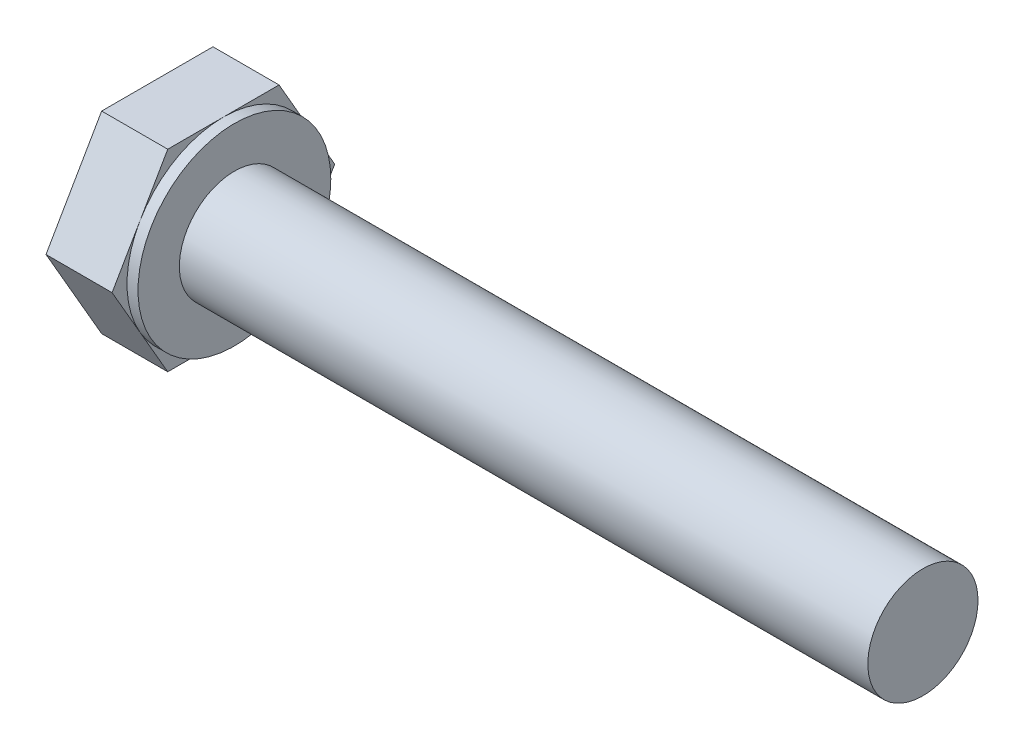
ISO-10303-21;
HEADER;
FILE_DESCRIPTION(('STEP AP214'),'2;1');
FILE_NAME('part.step','',(''),(''),'','','');
FILE_SCHEMA(('AUTOMOTIVE_DESIGN { 1 0 10303 214 1 1 1 1 }'));
ENDSEC;
DATA;
#1=APPLICATION_CONTEXT('core data for automotive mechanical design processes');
#2=APPLICATION_PROTOCOL_DEFINITION('international standard','automotive_design',2000,#1);
#3=PRODUCT_CONTEXT('',#1,'mechanical');
#4=PRODUCT('Part','Part','',(#3));
#5=PRODUCT_RELATED_PRODUCT_CATEGORY('part','',(#4));
#6=PRODUCT_DEFINITION_FORMATION('','',#4);
#7=PRODUCT_DEFINITION_CONTEXT('part definition',#1,'design');
#8=PRODUCT_DEFINITION('design','',#6,#7);
#9=PRODUCT_DEFINITION_SHAPE('','',#8);
#10=(LENGTH_UNIT() NAMED_UNIT(*) SI_UNIT(.MILLI.,.METRE.));
#11=(NAMED_UNIT(*) PLANE_ANGLE_UNIT() SI_UNIT($,.RADIAN.));
#12=(NAMED_UNIT(*) SI_UNIT($,.STERADIAN.) SOLID_ANGLE_UNIT());
#13=UNCERTAINTY_MEASURE_WITH_UNIT(LENGTH_MEASURE(1.E-05),#10,'distance_accuracy_value','');
#14=(GEOMETRIC_REPRESENTATION_CONTEXT(3) GLOBAL_UNCERTAINTY_ASSIGNED_CONTEXT((#13)) GLOBAL_UNIT_ASSIGNED_CONTEXT((#10,
#11,#12)) REPRESENTATION_CONTEXT('',''));
#15=CARTESIAN_POINT('',(0.,0.,0.));
#16=DIRECTION('',(0.,0.,1.));
#17=DIRECTION('',(1.,0.,0.));
#18=AXIS2_PLACEMENT_3D('',#15,#16,#17);
#19=CARTESIAN_POINT('',(0.4,0.,0.));
#20=DIRECTION('',(1.,0.,0.));
#21=DIRECTION('',(0.,0.,-1.));
#22=AXIS2_PLACEMENT_3D('',#19,#20,#21);
#23=PLANE('',#22);
#24=CARTESIAN_POINT('',(0.4,0.,0.));
#25=DIRECTION('',(1.,0.,0.));
#26=DIRECTION('',(0.,0.,-1.));
#27=AXIS2_PLACEMENT_3D('',#24,#25,#26);
#28=CIRCLE('',#27,3.5);
#29=CARTESIAN_POINT('',(0.4,0.,-3.5));
#30=VERTEX_POINT('',#29);
#31=EDGE_CURVE('E126',#30,#30,#28,.T.);
#32=ORIENTED_EDGE('',*,*,#31,.T.);
#33=EDGE_LOOP('',(#32));
#34=FACE_BOUND('',#33,.T.);
#35=CARTESIAN_POINT('',(0.4,0.,0.));
#36=DIRECTION('',(1.,0.,0.));
#37=DIRECTION('',(0.,0.,-1.));
#38=AXIS2_PLACEMENT_3D('',#35,#36,#37);
#39=CIRCLE('',#38,2.);
#40=CARTESIAN_POINT('',(0.4,0.,-2.));
#41=VERTEX_POINT('',#40);
#42=EDGE_CURVE('E349',#41,#41,#39,.T.);
#43=ORIENTED_EDGE('',*,*,#42,.F.);
#44=EDGE_LOOP('',(#43));
#45=FACE_BOUND('',#44,.T.);
#46=ADVANCED_FACE('F33',(#34,#45),#23,.T.);
#47=CARTESIAN_POINT('',(0.,0.,0.));
#48=DIRECTION('',(1.,0.,0.));
#49=DIRECTION('',(0.,0.,-1.));
#50=AXIS2_PLACEMENT_3D('',#47,#48,#49);
#51=PLANE('',#50);
#52=CARTESIAN_POINT('',(0.,0.,0.));
#53=DIRECTION('',(1.,0.,0.));
#54=DIRECTION('',(0.,0.,-1.));
#55=AXIS2_PLACEMENT_3D('',#52,#53,#54);
#56=CIRCLE('',#55,3.5);
#57=CARTESIAN_POINT('',(0.,1.75,-3.03108891324554));
#58=VERTEX_POINT('',#57);
#59=CARTESIAN_POINT('',(0.,3.5,0.));
#60=VERTEX_POINT('',#59);
#61=EDGE_CURVE('E44',#58,#60,#56,.T.);
#62=ORIENTED_EDGE('',*,*,#61,.F.);
#63=DIRECTION('',(0.,0.866025403784439,0.5));
#64=VECTOR('',#63,1.);
#65=CARTESIAN_POINT('',(0.,0.,-4.04145188432738));
#66=LINE('',#65,#64);
#67=CARTESIAN_POINT('',(0.,3.5,-2.02072594216369));
#68=VERTEX_POINT('',#67);
#69=EDGE_CURVE('E111',#58,#68,#66,.T.);
#70=ORIENTED_EDGE('',*,*,#69,.T.);
#71=DIRECTION('',(0.,0.,1.));
#72=VECTOR('',#71,1.);
#73=CARTESIAN_POINT('',(0.,3.5,-2.02072594216369));
#74=LINE('',#73,#72);
#75=EDGE_CURVE('E124',#68,#60,#74,.T.);
#76=ORIENTED_EDGE('',*,*,#75,.T.);
#77=EDGE_LOOP('',(#62,#70,#76));
#78=FACE_BOUND('',#77,.T.);
#79=ADVANCED_FACE('F123',(#78),#51,.T.);
#80=CARTESIAN_POINT('',(0.,1.75,3.03108891324554));
#81=VERTEX_POINT('',#80);
#82=EDGE_CURVE('E11',#60,#81,#56,.T.);
#83=ORIENTED_EDGE('',*,*,#82,.F.);
#84=CARTESIAN_POINT('',(0.,3.5,2.02072594216369));
#85=VERTEX_POINT('',#84);
#86=EDGE_CURVE('E110',#60,#85,#74,.T.);
#87=ORIENTED_EDGE('',*,*,#86,.T.);
#88=DIRECTION('',(0.,-0.866025403784439,0.5));
#89=VECTOR('',#88,1.);
#90=CARTESIAN_POINT('',(0.,3.5,2.02072594216369));
#91=LINE('',#90,#89);
#92=EDGE_CURVE('E156',#85,#81,#91,.T.);
#93=ORIENTED_EDGE('',*,*,#92,.T.);
#94=EDGE_LOOP('',(#83,#87,#93));
#95=FACE_BOUND('',#94,.T.);
#96=ADVANCED_FACE('F209',(#95),#51,.T.);
#97=CARTESIAN_POINT('',(0.,-1.75,3.03108891324554));
#98=VERTEX_POINT('',#97);
#99=EDGE_CURVE('E42',#81,#98,#56,.T.);
#100=ORIENTED_EDGE('',*,*,#99,.F.);
#101=CARTESIAN_POINT('',(0.,0.,4.04145188432738));
#102=VERTEX_POINT('',#101);
#103=EDGE_CURVE('E159',#81,#102,#91,.T.);
#104=ORIENTED_EDGE('',*,*,#103,.T.);
#105=DIRECTION('',(0.,-0.866025403784439,-0.5));
#106=VECTOR('',#105,1.);
#107=CARTESIAN_POINT('',(0.,0.,4.04145188432738));
#108=LINE('',#107,#106);
#109=EDGE_CURVE('E160',#102,#98,#108,.T.);
#110=ORIENTED_EDGE('',*,*,#109,.T.);
#111=EDGE_LOOP('',(#100,#104,#110));
#112=FACE_BOUND('',#111,.T.);
#113=ADVANCED_FACE('F190',(#112),#51,.T.);
#114=CARTESIAN_POINT('',(0.,-3.5,0.));
#115=VERTEX_POINT('',#114);
#116=EDGE_CURVE('E133',#98,#115,#56,.T.);
#117=ORIENTED_EDGE('',*,*,#116,.F.);
#118=CARTESIAN_POINT('',(0.,-3.5,2.02072594216369));
#119=VERTEX_POINT('',#118);
#120=EDGE_CURVE('E158',#98,#119,#108,.T.);
#121=ORIENTED_EDGE('',*,*,#120,.T.);
#122=DIRECTION('',(0.,0.,-1.));
#123=VECTOR('',#122,1.);
#124=CARTESIAN_POINT('',(0.,-3.5,2.02072594216369));
#125=LINE('',#124,#123);
#126=EDGE_CURVE('E164',#119,#115,#125,.T.);
#127=ORIENTED_EDGE('',*,*,#126,.T.);
#128=EDGE_LOOP('',(#117,#121,#127));
#129=FACE_BOUND('',#128,.T.);
#130=ADVANCED_FACE('F192',(#129),#51,.T.);
#131=CARTESIAN_POINT('',(0.,-1.75,-3.03108891324553));
#132=VERTEX_POINT('',#131);
#133=EDGE_CURVE('E131',#115,#132,#56,.T.);
#134=ORIENTED_EDGE('',*,*,#133,.F.);
#135=CARTESIAN_POINT('',(0.,-3.5,-2.02072594216369));
#136=VERTEX_POINT('',#135);
#137=EDGE_CURVE('E163',#115,#136,#125,.T.);
#138=ORIENTED_EDGE('',*,*,#137,.T.);
#139=DIRECTION('',(0.,0.866025403784439,-0.5));
#140=VECTOR('',#139,1.);
#141=CARTESIAN_POINT('',(0.,-3.5,-2.02072594216369));
#142=LINE('',#141,#140);
#143=EDGE_CURVE('E121',#136,#132,#142,.T.);
#144=ORIENTED_EDGE('',*,*,#143,.T.);
#145=EDGE_LOOP('',(#134,#138,#144));
#146=FACE_BOUND('',#145,.T.);
#147=ADVANCED_FACE('F199',(#146),#51,.T.);
#148=CARTESIAN_POINT('',(-2.4,3.5,2.02072594216369));
#149=DIRECTION('',(0.,0.5,0.866025403784439));
#150=DIRECTION('',(0.,-0.866025403784439,0.5));
#151=AXIS2_PLACEMENT_3D('',#148,#149,#150);
#152=PLANE('',#151);
#153=ORIENTED_EDGE('',*,*,#92,.F.);
#154=DIRECTION('',(1.,0.,0.));
#155=VECTOR('',#154,1.);
#156=CARTESIAN_POINT('',(-2.4,3.5,2.02072594216369));
#157=LINE('',#156,#155);
#158=CARTESIAN_POINT('',(-2.4,3.5,2.02072594216369));
#159=VERTEX_POINT('',#158);
#160=EDGE_CURVE('E132',#159,#85,#157,.T.);
#161=ORIENTED_EDGE('',*,*,#160,.F.);
#162=DIRECTION('',(0.,-0.866025403784439,0.5));
#163=VECTOR('',#162,1.);
#164=CARTESIAN_POINT('',(-2.4,3.5,2.02072594216369));
#165=LINE('',#164,#163);
#166=CARTESIAN_POINT('',(-2.4,0.,4.04145188432738));
#167=VERTEX_POINT('',#166);
#168=EDGE_CURVE('E139',#159,#167,#165,.T.);
#169=ORIENTED_EDGE('',*,*,#168,.T.);
#170=DIRECTION('',(1.,0.,0.));
#171=VECTOR('',#170,1.);
#172=CARTESIAN_POINT('',(-2.4,0.,4.04145188432738));
#173=LINE('',#172,#171);
#174=EDGE_CURVE('E37',#167,#102,#173,.T.);
#175=ORIENTED_EDGE('',*,*,#174,.T.);
#176=ORIENTED_EDGE('',*,*,#103,.F.);
#177=EDGE_LOOP('',(#153,#161,#169,#175,#176));
#178=FACE_BOUND('',#177,.T.);
#179=ADVANCED_FACE('F35',(#178),#152,.T.);
#180=CARTESIAN_POINT('',(-2.4,3.5,-2.02072594216369));
#181=DIRECTION('',(0.,1.,0.));
#182=DIRECTION('',(0.,0.,1.));
#183=AXIS2_PLACEMENT_3D('',#180,#181,#182);
#184=PLANE('',#183);
#185=ORIENTED_EDGE('',*,*,#75,.F.);
#186=DIRECTION('',(1.,0.,0.));
#187=VECTOR('',#186,1.);
#188=CARTESIAN_POINT('',(-2.4,3.5,-2.02072594216369));
#189=LINE('',#188,#187);
#190=CARTESIAN_POINT('',(-2.4,3.5,-2.02072594216369));
#191=VERTEX_POINT('',#190);
#192=EDGE_CURVE('E117',#191,#68,#189,.T.);
#193=ORIENTED_EDGE('',*,*,#192,.F.);
#194=DIRECTION('',(0.,0.,1.));
#195=VECTOR('',#194,1.);
#196=CARTESIAN_POINT('',(-2.4,3.5,-2.02072594216369));
#197=LINE('',#196,#195);
#198=EDGE_CURVE('E153',#191,#159,#197,.T.);
#199=ORIENTED_EDGE('',*,*,#198,.T.);
#200=ORIENTED_EDGE('',*,*,#160,.T.);
#201=ORIENTED_EDGE('',*,*,#86,.F.);
#202=EDGE_LOOP('',(#185,#193,#199,#200,#201));
#203=FACE_BOUND('',#202,.T.);
#204=ADVANCED_FACE('F208',(#203),#184,.T.);
#205=CARTESIAN_POINT('',(-2.4,0.,-4.04145188432738));
#206=DIRECTION('',(0.,0.5,-0.866025403784439));
#207=DIRECTION('',(0.,0.866025403784439,0.5));
#208=AXIS2_PLACEMENT_3D('',#205,#206,#207);
#209=PLANE('',#208);
#210=CARTESIAN_POINT('',(0.,0.,-4.04145188432738));
#211=VERTEX_POINT('',#210);
#212=EDGE_CURVE('E104',#211,#58,#66,.T.);
#213=ORIENTED_EDGE('',*,*,#212,.F.);
#214=DIRECTION('',(1.,0.,0.));
#215=VECTOR('',#214,1.);
#216=CARTESIAN_POINT('',(-2.4,0.,-4.04145188432738));
#217=LINE('',#216,#215);
#218=CARTESIAN_POINT('',(-2.4,0.,-4.04145188432738));
#219=VERTEX_POINT('',#218);
#220=EDGE_CURVE('E171',#219,#211,#217,.T.);
#221=ORIENTED_EDGE('',*,*,#220,.F.);
#222=DIRECTION('',(0.,0.866025403784439,0.5));
#223=VECTOR('',#222,1.);
#224=CARTESIAN_POINT('',(-2.4,0.,-4.04145188432738));
#225=LINE('',#224,#223);
#226=EDGE_CURVE('E151',#219,#191,#225,.T.);
#227=ORIENTED_EDGE('',*,*,#226,.T.);
#228=ORIENTED_EDGE('',*,*,#192,.T.);
#229=ORIENTED_EDGE('',*,*,#69,.F.);
#230=EDGE_LOOP('',(#213,#221,#227,#228,#229));
#231=FACE_BOUND('',#230,.T.);
#232=ADVANCED_FACE('F115',(#231),#209,.T.);
#233=CARTESIAN_POINT('',(-2.4,-3.5,-2.02072594216369));
#234=DIRECTION('',(0.,-0.5,-0.866025403784439));
#235=DIRECTION('',(0.,0.866025403784439,-0.5));
#236=AXIS2_PLACEMENT_3D('',#233,#234,#235);
#237=PLANE('',#236);
#238=ORIENTED_EDGE('',*,*,#143,.F.);
#239=DIRECTION('',(1.,0.,0.));
#240=VECTOR('',#239,1.);
#241=CARTESIAN_POINT('',(-2.4,-3.5,-2.02072594216369));
#242=LINE('',#241,#240);
#243=CARTESIAN_POINT('',(-2.4,-3.5,-2.02072594216369));
#244=VERTEX_POINT('',#243);
#245=EDGE_CURVE('E173',#244,#136,#242,.T.);
#246=ORIENTED_EDGE('',*,*,#245,.F.);
#247=DIRECTION('',(0.,0.866025403784439,-0.5));
#248=VECTOR('',#247,1.);
#249=CARTESIAN_POINT('',(-2.4,-3.5,-2.02072594216369));
#250=LINE('',#249,#248);
#251=EDGE_CURVE('E148',#244,#219,#250,.T.);
#252=ORIENTED_EDGE('',*,*,#251,.T.);
#253=ORIENTED_EDGE('',*,*,#220,.T.);
#254=EDGE_CURVE('E107',#132,#211,#142,.T.);
#255=ORIENTED_EDGE('',*,*,#254,.F.);
#256=EDGE_LOOP('',(#238,#246,#252,#253,#255));
#257=FACE_BOUND('',#256,.T.);
#258=ADVANCED_FACE('F201',(#257),#237,.T.);
#259=CARTESIAN_POINT('',(-2.4,-3.5,2.02072594216369));
#260=DIRECTION('',(0.,-1.,0.));
#261=DIRECTION('',(0.,0.,-1.));
#262=AXIS2_PLACEMENT_3D('',#259,#260,#261);
#263=PLANE('',#262);
#264=ORIENTED_EDGE('',*,*,#126,.F.);
#265=DIRECTION('',(1.,0.,0.));
#266=VECTOR('',#265,1.);
#267=CARTESIAN_POINT('',(-2.4,-3.5,2.02072594216369));
#268=LINE('',#267,#266);
#269=CARTESIAN_POINT('',(-2.4,-3.5,2.02072594216369));
#270=VERTEX_POINT('',#269);
#271=EDGE_CURVE('E175',#270,#119,#268,.T.);
#272=ORIENTED_EDGE('',*,*,#271,.F.);
#273=DIRECTION('',(0.,0.,-1.));
#274=VECTOR('',#273,1.);
#275=CARTESIAN_POINT('',(-2.4,-3.5,2.02072594216369));
#276=LINE('',#275,#274);
#277=EDGE_CURVE('E145',#270,#244,#276,.T.);
#278=ORIENTED_EDGE('',*,*,#277,.T.);
#279=ORIENTED_EDGE('',*,*,#245,.T.);
#280=ORIENTED_EDGE('',*,*,#137,.F.);
#281=EDGE_LOOP('',(#264,#272,#278,#279,#280));
#282=FACE_BOUND('',#281,.T.);
#283=ADVANCED_FACE('F195',(#282),#263,.T.);
#284=CARTESIAN_POINT('',(-2.4,0.,4.04145188432738));
#285=DIRECTION('',(0.,-0.5,0.866025403784439));
#286=DIRECTION('',(0.,-0.866025403784439,-0.5));
#287=AXIS2_PLACEMENT_3D('',#284,#285,#286);
#288=PLANE('',#287);
#289=ORIENTED_EDGE('',*,*,#109,.F.);
#290=ORIENTED_EDGE('',*,*,#174,.F.);
#291=DIRECTION('',(0.,-0.866025403784439,-0.5));
#292=VECTOR('',#291,1.);
#293=CARTESIAN_POINT('',(-2.4,0.,4.04145188432738));
#294=LINE('',#293,#292);
#295=EDGE_CURVE('E142',#167,#270,#294,.T.);
#296=ORIENTED_EDGE('',*,*,#295,.T.);
#297=ORIENTED_EDGE('',*,*,#271,.T.);
#298=ORIENTED_EDGE('',*,*,#120,.F.);
#299=EDGE_LOOP('',(#289,#290,#296,#297,#298));
#300=FACE_BOUND('',#299,.T.);
#301=ADVANCED_FACE('F187',(#300),#288,.T.);
#302=CARTESIAN_POINT('',(-2.4,0.,0.));
#303=DIRECTION('',(1.,0.,0.));
#304=DIRECTION('',(0.,0.,-1.));
#305=AXIS2_PLACEMENT_3D('',#302,#303,#304);
#306=PLANE('',#305);
#307=ORIENTED_EDGE('',*,*,#168,.F.);
#308=ORIENTED_EDGE('',*,*,#198,.F.);
#309=ORIENTED_EDGE('',*,*,#226,.F.);
#310=ORIENTED_EDGE('',*,*,#251,.F.);
#311=ORIENTED_EDGE('',*,*,#277,.F.);
#312=ORIENTED_EDGE('',*,*,#295,.F.);
#313=EDGE_LOOP('',(#307,#308,#309,#310,#311,#312));
#314=FACE_BOUND('',#313,.T.);
#315=ADVANCED_FACE('F206',(#314),#306,.F.);
#316=EDGE_CURVE('E57',#132,#58,#56,.T.);
#317=ORIENTED_EDGE('',*,*,#316,.F.);
#318=ORIENTED_EDGE('',*,*,#254,.T.);
#319=ORIENTED_EDGE('',*,*,#212,.T.);
#320=EDGE_LOOP('',(#317,#318,#319));
#321=FACE_BOUND('',#320,.T.);
#322=ADVANCED_FACE('F106',(#321),#51,.T.);
#323=CARTESIAN_POINT('',(0.4,0.,0.));
#324=DIRECTION('',(-1.,0.,0.));
#325=DIRECTION('',(0.,0.,1.));
#326=AXIS2_PLACEMENT_3D('',#323,#324,#325);
#327=CYLINDRICAL_SURFACE('',#326,3.5);
#328=ORIENTED_EDGE('',*,*,#31,.F.);
#329=EDGE_LOOP('',(#328));
#330=FACE_BOUND('',#329,.T.);
#331=ORIENTED_EDGE('',*,*,#61,.T.);
#332=ORIENTED_EDGE('',*,*,#82,.T.);
#333=ORIENTED_EDGE('',*,*,#99,.T.);
#334=ORIENTED_EDGE('',*,*,#116,.T.);
#335=ORIENTED_EDGE('',*,*,#133,.T.);
#336=ORIENTED_EDGE('',*,*,#316,.T.);
#337=EDGE_LOOP('',(#331,#332,#333,#334,#335,#336));
#338=FACE_BOUND('',#337,.T.);
#339=ADVANCED_FACE('F129',(#330,#338),#327,.T.);
#340=CARTESIAN_POINT('',(25.4,0.,0.));
#341=DIRECTION('',(-1.,0.,0.));
#342=DIRECTION('',(0.,0.,1.));
#343=AXIS2_PLACEMENT_3D('',#340,#341,#342);
#344=CYLINDRICAL_SURFACE('',#343,2.);
#345=CARTESIAN_POINT('',(25.4,0.,0.));
#346=DIRECTION('',(1.,0.,0.));
#347=DIRECTION('',(0.,0.,-1.));
#348=AXIS2_PLACEMENT_3D('',#345,#346,#347);
#349=CIRCLE('',#348,2.);
#350=CARTESIAN_POINT('',(25.4,0.,-2.));
#351=VERTEX_POINT('',#350);
#352=EDGE_CURVE('E127',#351,#351,#349,.T.);
#353=ORIENTED_EDGE('',*,*,#352,.F.);
#354=EDGE_LOOP('',(#353));
#355=FACE_BOUND('',#354,.T.);
#356=ORIENTED_EDGE('',*,*,#42,.T.);
#357=EDGE_LOOP('',(#356));
#358=FACE_BOUND('',#357,.T.);
#359=ADVANCED_FACE('F227',(#355,#358),#344,.T.);
#360=CARTESIAN_POINT('',(25.4,0.,0.));
#361=DIRECTION('',(1.,0.,0.));
#362=DIRECTION('',(0.,0.,-1.));
#363=AXIS2_PLACEMENT_3D('',#360,#361,#362);
#364=PLANE('',#363);
#365=ORIENTED_EDGE('',*,*,#352,.T.);
#366=EDGE_LOOP('',(#365));
#367=FACE_BOUND('',#366,.T.);
#368=ADVANCED_FACE('F335',(#367),#364,.T.);
#369=CLOSED_SHELL('',(#46,#79,#96,#113,#130,#147,#179,#204,#232,#258,#283,#301,#315,#322,#339,
#359,#368));
#370=MANIFOLD_SOLID_BREP('B2',#369);
#371=ADVANCED_BREP_SHAPE_REPRESENTATION('',(#18,#370),#14);
#372=SHAPE_DEFINITION_REPRESENTATION(#9,#371);
ENDSEC;
END-ISO-10303-21;
